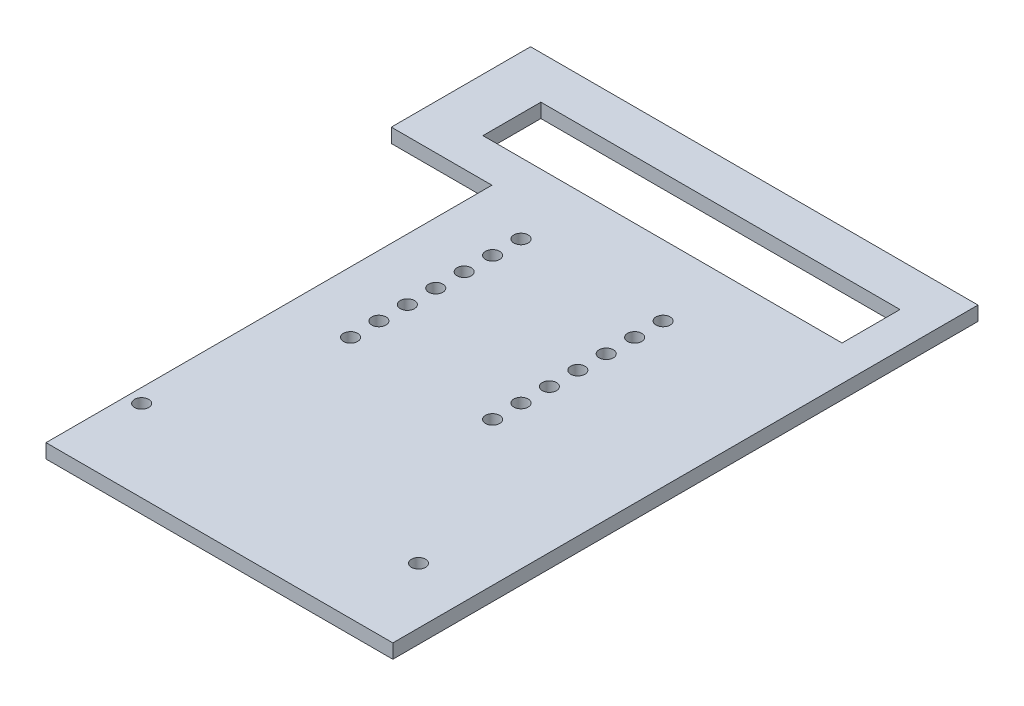
ISO-10303-21;
HEADER;
FILE_DESCRIPTION(('STEP AP214'),'2;1');
FILE_NAME('part.step','',(''),(''),'','','');
FILE_SCHEMA(('AUTOMOTIVE_DESIGN { 1 0 10303 214 1 1 1 1 }'));
ENDSEC;
DATA;
#1=APPLICATION_CONTEXT('core data for automotive mechanical design processes');
#2=APPLICATION_PROTOCOL_DEFINITION('international standard','automotive_design',2000,#1);
#3=PRODUCT_CONTEXT('',#1,'mechanical');
#4=PRODUCT('Part','Part','',(#3));
#5=PRODUCT_RELATED_PRODUCT_CATEGORY('part','',(#4));
#6=PRODUCT_DEFINITION_FORMATION('','',#4);
#7=PRODUCT_DEFINITION_CONTEXT('part definition',#1,'design');
#8=PRODUCT_DEFINITION('design','',#6,#7);
#9=PRODUCT_DEFINITION_SHAPE('','',#8);
#10=(LENGTH_UNIT() NAMED_UNIT(*) SI_UNIT(.MILLI.,.METRE.));
#11=(NAMED_UNIT(*) PLANE_ANGLE_UNIT() SI_UNIT($,.RADIAN.));
#12=(NAMED_UNIT(*) SI_UNIT($,.STERADIAN.) SOLID_ANGLE_UNIT());
#13=UNCERTAINTY_MEASURE_WITH_UNIT(LENGTH_MEASURE(1.E-05),#10,'distance_accuracy_value','');
#14=(GEOMETRIC_REPRESENTATION_CONTEXT(3) GLOBAL_UNCERTAINTY_ASSIGNED_CONTEXT((#13)) GLOBAL_UNIT_ASSIGNED_CONTEXT((#10,
#11,#12)) REPRESENTATION_CONTEXT('',''));
#15=CARTESIAN_POINT('',(0.,0.,0.));
#16=DIRECTION('',(0.,0.,1.));
#17=DIRECTION('',(1.,0.,0.));
#18=AXIS2_PLACEMENT_3D('',#15,#16,#17);
#19=CARTESIAN_POINT('',(-80.,-3.175,-112.5));
#20=DIRECTION('',(0.,0.,-1.));
#21=DIRECTION('',(-1.,0.,0.));
#22=AXIS2_PLACEMENT_3D('',#19,#20,#21);
#23=PLANE('',#22);
#24=DIRECTION('',(0.,-1.,0.));
#25=VECTOR('',#24,1.);
#26=CARTESIAN_POINT('',(0.,-3.175,-112.5));
#27=LINE('',#26,#25);
#28=CARTESIAN_POINT('',(0.,0.,-112.5));
#29=VERTEX_POINT('',#28);
#30=CARTESIAN_POINT('',(0.,-3.175,-112.5));
#31=VERTEX_POINT('',#30);
#32=EDGE_CURVE('E264',#29,#31,#27,.T.);
#33=ORIENTED_EDGE('',*,*,#32,.F.);
#34=DIRECTION('',(-1.,0.,0.));
#35=VECTOR('',#34,1.);
#36=CARTESIAN_POINT('',(-80.,0.,-112.5));
#37=LINE('',#36,#35);
#38=CARTESIAN_POINT('',(100.,0.,-112.5));
#39=VERTEX_POINT('',#38);
#40=EDGE_CURVE('E126',#39,#29,#37,.T.);
#41=ORIENTED_EDGE('',*,*,#40,.F.);
#42=DIRECTION('',(0.,1.,0.));
#43=VECTOR('',#42,1.);
#44=CARTESIAN_POINT('',(100.,-3.175,-112.5));
#45=LINE('',#44,#43);
#46=CARTESIAN_POINT('',(100.,-3.175,-112.5));
#47=VERTEX_POINT('',#46);
#48=EDGE_CURVE('E40',#47,#39,#45,.T.);
#49=ORIENTED_EDGE('',*,*,#48,.F.);
#50=DIRECTION('',(-1.,0.,0.));
#51=VECTOR('',#50,1.);
#52=CARTESIAN_POINT('',(-80.,-3.175,-112.5));
#53=LINE('',#52,#51);
#54=EDGE_CURVE('E134',#47,#31,#53,.T.);
#55=ORIENTED_EDGE('',*,*,#54,.T.);
#56=EDGE_LOOP('',(#33,#41,#49,#55));
#57=FACE_BOUND('',#56,.T.);
#58=ADVANCED_FACE('F32',(#57),#23,.T.);
#59=CARTESIAN_POINT('',(100.,-3.175,-112.5));
#60=DIRECTION('',(1.,0.,0.));
#61=DIRECTION('',(0.,0.,-1.));
#62=AXIS2_PLACEMENT_3D('',#59,#60,#61);
#63=PLANE('',#62);
#64=DIRECTION('',(0.,1.,0.));
#65=VECTOR('',#64,1.);
#66=CARTESIAN_POINT('',(100.,-3.175,18.2795002758667));
#67=LINE('',#66,#65);
#68=CARTESIAN_POINT('',(100.,-3.175,18.2795002758667));
#69=VERTEX_POINT('',#68);
#70=CARTESIAN_POINT('',(100.,0.,18.2795002758667));
#71=VERTEX_POINT('',#70);
#72=EDGE_CURVE('E107',#69,#71,#67,.T.);
#73=ORIENTED_EDGE('',*,*,#72,.F.);
#74=DIRECTION('',(0.,0.,-1.));
#75=VECTOR('',#74,1.);
#76=CARTESIAN_POINT('',(100.,-3.175,-112.5));
#77=LINE('',#76,#75);
#78=EDGE_CURVE('E129',#69,#47,#77,.T.);
#79=ORIENTED_EDGE('',*,*,#78,.T.);
#80=ORIENTED_EDGE('',*,*,#48,.T.);
#81=DIRECTION('',(0.,0.,-1.));
#82=VECTOR('',#81,1.);
#83=CARTESIAN_POINT('',(100.,0.,-112.5));
#84=LINE('',#83,#82);
#85=EDGE_CURVE('E120',#71,#39,#84,.T.);
#86=ORIENTED_EDGE('',*,*,#85,.F.);
#87=EDGE_LOOP('',(#73,#79,#80,#86));
#88=FACE_BOUND('',#87,.T.);
#89=ADVANCED_FACE('F34',(#88),#63,.T.);
#90=CARTESIAN_POINT('',(-80.,-3.175,0.));
#91=DIRECTION('',(0.,1.,0.));
#92=DIRECTION('',(0.,0.,1.));
#93=AXIS2_PLACEMENT_3D('',#90,#91,#92);
#94=PLANE('',#93);
#95=CARTESIAN_POINT('',(87.4621488064451,-3.175,0.));
#96=DIRECTION('',(0.,1.,0.));
#97=DIRECTION('',(0.,0.,1.));
#98=AXIS2_PLACEMENT_3D('',#95,#96,#97);
#99=CIRCLE('',#98,1.5875);
#100=CARTESIAN_POINT('',(87.4621488064451,-3.175,1.5875));
#101=VERTEX_POINT('',#100);
#102=EDGE_CURVE('E258',#101,#101,#99,.T.);
#103=ORIENTED_EDGE('',*,*,#102,.T.);
#104=EDGE_LOOP('',(#103));
#105=FACE_BOUND('',#104,.T.);
#106=CARTESIAN_POINT('',(25.5827615819861,-3.175,0.));
#107=DIRECTION('',(0.,1.,0.));
#108=DIRECTION('',(0.,0.,1.));
#109=AXIS2_PLACEMENT_3D('',#106,#107,#108);
#110=CIRCLE('',#109,1.5875);
#111=CARTESIAN_POINT('',(25.5827615819861,-3.175,1.5875));
#112=VERTEX_POINT('',#111);
#113=EDGE_CURVE('E252',#112,#112,#110,.T.);
#114=ORIENTED_EDGE('',*,*,#113,.T.);
#115=EDGE_LOOP('',(#114));
#116=FACE_BOUND('',#115,.T.);
#117=CARTESIAN_POINT('',(67.8940457021954,-3.175,-36.1188));
#118=DIRECTION('',(0.,1.,0.));
#119=DIRECTION('',(0.,0.,1.));
#120=AXIS2_PLACEMENT_3D('',#117,#118,#119);
#121=CIRCLE('',#120,1.58749999999999);
#122=CARTESIAN_POINT('',(67.8940457021954,-3.175,-34.5313));
#123=VERTEX_POINT('',#122);
#124=EDGE_CURVE('E246',#123,#123,#121,.T.);
#125=ORIENTED_EDGE('',*,*,#124,.T.);
#126=EDGE_LOOP('',(#125));
#127=FACE_BOUND('',#126,.T.);
#128=CARTESIAN_POINT('',(67.8940457021954,-3.175,-42.4688));
#129=DIRECTION('',(0.,1.,0.));
#130=DIRECTION('',(0.,0.,1.));
#131=AXIS2_PLACEMENT_3D('',#128,#129,#130);
#132=CIRCLE('',#131,1.58749999999999);
#133=CARTESIAN_POINT('',(67.8940457021954,-3.175,-40.8813));
#134=VERTEX_POINT('',#133);
#135=EDGE_CURVE('E240',#134,#134,#132,.T.);
#136=ORIENTED_EDGE('',*,*,#135,.T.);
#137=EDGE_LOOP('',(#136));
#138=FACE_BOUND('',#137,.T.);
#139=CARTESIAN_POINT('',(67.8940457021954,-3.175,-48.8188));
#140=DIRECTION('',(0.,1.,0.));
#141=DIRECTION('',(0.,0.,1.));
#142=AXIS2_PLACEMENT_3D('',#139,#140,#141);
#143=CIRCLE('',#142,1.58749999999999);
#144=CARTESIAN_POINT('',(67.8940457021954,-3.175,-47.2313));
#145=VERTEX_POINT('',#144);
#146=EDGE_CURVE('E234',#145,#145,#143,.T.);
#147=ORIENTED_EDGE('',*,*,#146,.T.);
#148=EDGE_LOOP('',(#147));
#149=FACE_BOUND('',#148,.T.);
#150=CARTESIAN_POINT('',(67.8940457021954,-3.175,-55.1688));
#151=DIRECTION('',(0.,1.,0.));
#152=DIRECTION('',(0.,0.,1.));
#153=AXIS2_PLACEMENT_3D('',#150,#151,#152);
#154=CIRCLE('',#153,1.58749999999999);
#155=CARTESIAN_POINT('',(67.8940457021954,-3.175,-53.5813));
#156=VERTEX_POINT('',#155);
#157=EDGE_CURVE('E228',#156,#156,#154,.T.);
#158=ORIENTED_EDGE('',*,*,#157,.T.);
#159=EDGE_LOOP('',(#158));
#160=FACE_BOUND('',#159,.T.);
#161=CARTESIAN_POINT('',(67.8940457021954,-3.175,-61.5188));
#162=DIRECTION('',(0.,1.,0.));
#163=DIRECTION('',(0.,0.,1.));
#164=AXIS2_PLACEMENT_3D('',#161,#162,#163);
#165=CIRCLE('',#164,1.58749999999999);
#166=CARTESIAN_POINT('',(67.8940457021954,-3.175,-59.9313));
#167=VERTEX_POINT('',#166);
#168=EDGE_CURVE('E222',#167,#167,#165,.T.);
#169=ORIENTED_EDGE('',*,*,#168,.T.);
#170=EDGE_LOOP('',(#169));
#171=FACE_BOUND('',#170,.T.);
#172=CARTESIAN_POINT('',(67.8940457021954,-3.175,-67.8688));
#173=DIRECTION('',(0.,1.,0.));
#174=DIRECTION('',(0.,0.,1.));
#175=AXIS2_PLACEMENT_3D('',#172,#173,#174);
#176=CIRCLE('',#175,1.58749999999999);
#177=CARTESIAN_POINT('',(67.8940457021954,-3.175,-66.2813));
#178=VERTEX_POINT('',#177);
#179=EDGE_CURVE('E216',#178,#178,#176,.T.);
#180=ORIENTED_EDGE('',*,*,#179,.T.);
#181=EDGE_LOOP('',(#180));
#182=FACE_BOUND('',#181,.T.);
#183=CARTESIAN_POINT('',(67.8940457021954,-3.175,-74.2188));
#184=DIRECTION('',(0.,1.,0.));
#185=DIRECTION('',(0.,0.,1.));
#186=AXIS2_PLACEMENT_3D('',#183,#184,#185);
#187=CIRCLE('',#186,1.58749999999999);
#188=CARTESIAN_POINT('',(67.8940457021954,-3.175,-72.6313));
#189=VERTEX_POINT('',#188);
#190=EDGE_CURVE('E210',#189,#189,#187,.T.);
#191=ORIENTED_EDGE('',*,*,#190,.T.);
#192=EDGE_LOOP('',(#191));
#193=FACE_BOUND('',#192,.T.);
#194=CARTESIAN_POINT('',(36.1440457021954,-3.175,-36.1188));
#195=DIRECTION('',(0.,1.,0.));
#196=DIRECTION('',(0.,0.,1.));
#197=AXIS2_PLACEMENT_3D('',#194,#195,#196);
#198=CIRCLE('',#197,1.5875);
#199=CARTESIAN_POINT('',(36.1440457021954,-3.175,-34.5313));
#200=VERTEX_POINT('',#199);
#201=EDGE_CURVE('E204',#200,#200,#198,.T.);
#202=ORIENTED_EDGE('',*,*,#201,.T.);
#203=EDGE_LOOP('',(#202));
#204=FACE_BOUND('',#203,.T.);
#205=CARTESIAN_POINT('',(36.1440457021954,-3.175,-42.4688));
#206=DIRECTION('',(0.,1.,0.));
#207=DIRECTION('',(0.,0.,1.));
#208=AXIS2_PLACEMENT_3D('',#205,#206,#207);
#209=CIRCLE('',#208,1.5875);
#210=CARTESIAN_POINT('',(36.1440457021954,-3.175,-40.8813));
#211=VERTEX_POINT('',#210);
#212=EDGE_CURVE('E198',#211,#211,#209,.T.);
#213=ORIENTED_EDGE('',*,*,#212,.T.);
#214=EDGE_LOOP('',(#213));
#215=FACE_BOUND('',#214,.T.);
#216=CARTESIAN_POINT('',(36.1440457021954,-3.175,-48.8188));
#217=DIRECTION('',(0.,1.,0.));
#218=DIRECTION('',(0.,0.,1.));
#219=AXIS2_PLACEMENT_3D('',#216,#217,#218);
#220=CIRCLE('',#219,1.5875);
#221=CARTESIAN_POINT('',(36.1440457021954,-3.175,-47.2313));
#222=VERTEX_POINT('',#221);
#223=EDGE_CURVE('E192',#222,#222,#220,.T.);
#224=ORIENTED_EDGE('',*,*,#223,.T.);
#225=EDGE_LOOP('',(#224));
#226=FACE_BOUND('',#225,.T.);
#227=CARTESIAN_POINT('',(36.1440457021954,-3.175,-55.1688));
#228=DIRECTION('',(0.,1.,0.));
#229=DIRECTION('',(0.,0.,1.));
#230=AXIS2_PLACEMENT_3D('',#227,#228,#229);
#231=CIRCLE('',#230,1.5875);
#232=CARTESIAN_POINT('',(36.1440457021954,-3.175,-53.5813));
#233=VERTEX_POINT('',#232);
#234=EDGE_CURVE('E186',#233,#233,#231,.T.);
#235=ORIENTED_EDGE('',*,*,#234,.T.);
#236=EDGE_LOOP('',(#235));
#237=FACE_BOUND('',#236,.T.);
#238=CARTESIAN_POINT('',(36.1440457021954,-3.175,-61.5188));
#239=DIRECTION('',(0.,1.,0.));
#240=DIRECTION('',(0.,0.,1.));
#241=AXIS2_PLACEMENT_3D('',#238,#239,#240);
#242=CIRCLE('',#241,1.5875);
#243=CARTESIAN_POINT('',(36.1440457021954,-3.175,-59.9313));
#244=VERTEX_POINT('',#243);
#245=EDGE_CURVE('E180',#244,#244,#242,.T.);
#246=ORIENTED_EDGE('',*,*,#245,.T.);
#247=EDGE_LOOP('',(#246));
#248=FACE_BOUND('',#247,.T.);
#249=CARTESIAN_POINT('',(36.1440457021954,-3.175,-67.8688));
#250=DIRECTION('',(0.,1.,0.));
#251=DIRECTION('',(0.,0.,1.));
#252=AXIS2_PLACEMENT_3D('',#249,#250,#251);
#253=CIRCLE('',#252,1.5875);
#254=CARTESIAN_POINT('',(36.1440457021954,-3.175,-66.2813));
#255=VERTEX_POINT('',#254);
#256=EDGE_CURVE('E174',#255,#255,#253,.T.);
#257=ORIENTED_EDGE('',*,*,#256,.T.);
#258=EDGE_LOOP('',(#257));
#259=FACE_BOUND('',#258,.T.);
#260=CARTESIAN_POINT('',(36.1440457021954,-3.175,-74.2188));
#261=DIRECTION('',(0.,1.,0.));
#262=DIRECTION('',(0.,0.,1.));
#263=AXIS2_PLACEMENT_3D('',#260,#261,#262);
#264=CIRCLE('',#263,1.5875);
#265=CARTESIAN_POINT('',(36.1440457021954,-3.175,-72.6313));
#266=VERTEX_POINT('',#265);
#267=EDGE_CURVE('E160',#266,#266,#264,.T.);
#268=ORIENTED_EDGE('',*,*,#267,.T.);
#269=EDGE_LOOP('',(#268));
#270=FACE_BOUND('',#269,.T.);
#271=DIRECTION('',(-1.,0.,0.));
#272=VECTOR('',#271,1.);
#273=CARTESIAN_POINT('',(11.8870457021954,-3.175,-102.9208));
#274=LINE('',#273,#272);
#275=CARTESIAN_POINT('',(92.1510457021954,-3.175,-102.9208));
#276=VERTEX_POINT('',#275);
#277=CARTESIAN_POINT('',(11.8870457021954,-3.175,-102.9208));
#278=VERTEX_POINT('',#277);
#279=EDGE_CURVE('E145',#276,#278,#274,.T.);
#280=ORIENTED_EDGE('',*,*,#279,.T.);
#281=DIRECTION('',(0.,0.,1.));
#282=VECTOR('',#281,1.);
#283=CARTESIAN_POINT('',(11.8870457021954,-3.175,-89.9668));
#284=LINE('',#283,#282);
#285=CARTESIAN_POINT('',(11.8870457021954,-3.175,-89.9668));
#286=VERTEX_POINT('',#285);
#287=EDGE_CURVE('E151',#278,#286,#284,.T.);
#288=ORIENTED_EDGE('',*,*,#287,.T.);
#289=DIRECTION('',(1.,0.,0.));
#290=VECTOR('',#289,1.);
#291=CARTESIAN_POINT('',(11.8870457021954,-3.175,-89.9668));
#292=LINE('',#291,#290);
#293=CARTESIAN_POINT('',(92.1510457021954,-3.175,-89.9668));
#294=VERTEX_POINT('',#293);
#295=EDGE_CURVE('E166',#286,#294,#292,.T.);
#296=ORIENTED_EDGE('',*,*,#295,.T.);
#297=DIRECTION('',(0.,0.,-1.));
#298=VECTOR('',#297,1.);
#299=CARTESIAN_POINT('',(92.1510457021954,-3.175,-89.9668));
#300=LINE('',#299,#298);
#301=EDGE_CURVE('E163',#294,#276,#300,.T.);
#302=ORIENTED_EDGE('',*,*,#301,.T.);
#303=EDGE_LOOP('',(#280,#288,#296,#302));
#304=FACE_BOUND('',#303,.T.);
#305=ORIENTED_EDGE('',*,*,#78,.F.);
#306=DIRECTION('',(-1.,0.,0.));
#307=VECTOR('',#306,1.);
#308=CARTESIAN_POINT('',(-71.9285537075507,-3.175,18.2795002758667));
#309=LINE('',#308,#307);
#310=CARTESIAN_POINT('',(22.4835921673436,-3.175,18.2795002758667));
#311=VERTEX_POINT('',#310);
#312=EDGE_CURVE('E110',#69,#311,#309,.T.);
#313=ORIENTED_EDGE('',*,*,#312,.T.);
#314=DIRECTION('',(0.,0.,-1.));
#315=VECTOR('',#314,1.);
#316=CARTESIAN_POINT('',(22.4835921673436,-3.175,78.7162878268351));
#317=LINE('',#316,#315);
#318=CARTESIAN_POINT('',(22.4835921673436,-3.175,-81.375621875039));
#319=VERTEX_POINT('',#318);
#320=EDGE_CURVE('E271',#311,#319,#317,.T.);
#321=ORIENTED_EDGE('',*,*,#320,.T.);
#322=DIRECTION('',(-1.,0.,0.));
#323=VECTOR('',#322,1.);
#324=CARTESIAN_POINT('',(0.,-3.175,-81.375621875039));
#325=LINE('',#324,#323);
#326=CARTESIAN_POINT('',(0.,-3.175,-81.375621875039));
#327=VERTEX_POINT('',#326);
#328=EDGE_CURVE('E274',#319,#327,#325,.T.);
#329=ORIENTED_EDGE('',*,*,#328,.T.);
#330=DIRECTION('',(0.,0.,-1.));
#331=VECTOR('',#330,1.);
#332=CARTESIAN_POINT('',(0.,-3.175,-118.606298549893));
#333=LINE('',#332,#331);
#334=EDGE_CURVE('E279',#327,#31,#333,.T.);
#335=ORIENTED_EDGE('',*,*,#334,.T.);
#336=ORIENTED_EDGE('',*,*,#54,.F.);
#337=EDGE_LOOP('',(#305,#313,#321,#329,#335,#336));
#338=FACE_BOUND('',#337,.T.);
#339=ADVANCED_FACE('F286',(#105,#116,#127,#138,#149,#160,#171,#182,#193,#204,#215,#226,#237,
#248,#259,#270,#304,#338),#94,.F.);
#340=CARTESIAN_POINT('',(-80.,0.,0.));
#341=DIRECTION('',(0.,1.,0.));
#342=DIRECTION('',(0.,0.,1.));
#343=AXIS2_PLACEMENT_3D('',#340,#341,#342);
#344=PLANE('',#343);
#345=DIRECTION('',(-1.,0.,0.));
#346=VECTOR('',#345,1.);
#347=CARTESIAN_POINT('',(-71.9285537075507,0.,18.2795002758667));
#348=LINE('',#347,#346);
#349=CARTESIAN_POINT('',(22.4835921673436,0.,18.2795002758667));
#350=VERTEX_POINT('',#349);
#351=EDGE_CURVE('E47',#71,#350,#348,.T.);
#352=ORIENTED_EDGE('',*,*,#351,.F.);
#353=ORIENTED_EDGE('',*,*,#85,.T.);
#354=ORIENTED_EDGE('',*,*,#40,.T.);
#355=DIRECTION('',(0.,0.,-1.));
#356=VECTOR('',#355,1.);
#357=CARTESIAN_POINT('',(0.,0.,-118.606298549893));
#358=LINE('',#357,#356);
#359=CARTESIAN_POINT('',(0.,0.,-81.375621875039));
#360=VERTEX_POINT('',#359);
#361=EDGE_CURVE('E275',#360,#29,#358,.T.);
#362=ORIENTED_EDGE('',*,*,#361,.F.);
#363=DIRECTION('',(-1.,0.,0.));
#364=VECTOR('',#363,1.);
#365=CARTESIAN_POINT('',(0.,0.,-81.375621875039));
#366=LINE('',#365,#364);
#367=CARTESIAN_POINT('',(22.4835921673436,0.,-81.375621875039));
#368=VERTEX_POINT('',#367);
#369=EDGE_CURVE('E54',#368,#360,#366,.T.);
#370=ORIENTED_EDGE('',*,*,#369,.F.);
#371=DIRECTION('',(0.,0.,-1.));
#372=VECTOR('',#371,1.);
#373=CARTESIAN_POINT('',(22.4835921673436,0.,78.7162878268351));
#374=LINE('',#373,#372);
#375=EDGE_CURVE('E122',#350,#368,#374,.T.);
#376=ORIENTED_EDGE('',*,*,#375,.F.);
#377=EDGE_LOOP('',(#352,#353,#354,#362,#370,#376));
#378=FACE_BOUND('',#377,.T.);
#379=CARTESIAN_POINT('',(87.4621488064451,0.,0.));
#380=DIRECTION('',(0.,1.,0.));
#381=DIRECTION('',(0.,0.,1.));
#382=AXIS2_PLACEMENT_3D('',#379,#380,#381);
#383=CIRCLE('',#382,1.5875);
#384=CARTESIAN_POINT('',(87.4621488064451,0.,1.5875));
#385=VERTEX_POINT('',#384);
#386=EDGE_CURVE('E261',#385,#385,#383,.T.);
#387=ORIENTED_EDGE('',*,*,#386,.F.);
#388=EDGE_LOOP('',(#387));
#389=FACE_BOUND('',#388,.T.);
#390=CARTESIAN_POINT('',(25.5827615819861,0.,0.));
#391=DIRECTION('',(0.,1.,0.));
#392=DIRECTION('',(0.,0.,1.));
#393=AXIS2_PLACEMENT_3D('',#390,#391,#392);
#394=CIRCLE('',#393,1.5875);
#395=CARTESIAN_POINT('',(25.5827615819861,0.,1.5875));
#396=VERTEX_POINT('',#395);
#397=EDGE_CURVE('E255',#396,#396,#394,.T.);
#398=ORIENTED_EDGE('',*,*,#397,.F.);
#399=EDGE_LOOP('',(#398));
#400=FACE_BOUND('',#399,.T.);
#401=CARTESIAN_POINT('',(67.8940457021954,0.,-36.1188));
#402=DIRECTION('',(0.,1.,0.));
#403=DIRECTION('',(0.,0.,1.));
#404=AXIS2_PLACEMENT_3D('',#401,#402,#403);
#405=CIRCLE('',#404,1.58749999999999);
#406=CARTESIAN_POINT('',(67.8940457021954,0.,-34.5313));
#407=VERTEX_POINT('',#406);
#408=EDGE_CURVE('E249',#407,#407,#405,.T.);
#409=ORIENTED_EDGE('',*,*,#408,.F.);
#410=EDGE_LOOP('',(#409));
#411=FACE_BOUND('',#410,.T.);
#412=CARTESIAN_POINT('',(67.8940457021954,0.,-42.4688));
#413=DIRECTION('',(0.,1.,0.));
#414=DIRECTION('',(0.,0.,1.));
#415=AXIS2_PLACEMENT_3D('',#412,#413,#414);
#416=CIRCLE('',#415,1.58749999999999);
#417=CARTESIAN_POINT('',(67.8940457021954,0.,-40.8813));
#418=VERTEX_POINT('',#417);
#419=EDGE_CURVE('E243',#418,#418,#416,.T.);
#420=ORIENTED_EDGE('',*,*,#419,.F.);
#421=EDGE_LOOP('',(#420));
#422=FACE_BOUND('',#421,.T.);
#423=CARTESIAN_POINT('',(67.8940457021954,0.,-48.8188));
#424=DIRECTION('',(0.,1.,0.));
#425=DIRECTION('',(0.,0.,1.));
#426=AXIS2_PLACEMENT_3D('',#423,#424,#425);
#427=CIRCLE('',#426,1.58749999999999);
#428=CARTESIAN_POINT('',(67.8940457021954,0.,-47.2313));
#429=VERTEX_POINT('',#428);
#430=EDGE_CURVE('E237',#429,#429,#427,.T.);
#431=ORIENTED_EDGE('',*,*,#430,.F.);
#432=EDGE_LOOP('',(#431));
#433=FACE_BOUND('',#432,.T.);
#434=CARTESIAN_POINT('',(67.8940457021954,0.,-55.1688));
#435=DIRECTION('',(0.,1.,0.));
#436=DIRECTION('',(0.,0.,1.));
#437=AXIS2_PLACEMENT_3D('',#434,#435,#436);
#438=CIRCLE('',#437,1.58749999999999);
#439=CARTESIAN_POINT('',(67.8940457021954,0.,-53.5813));
#440=VERTEX_POINT('',#439);
#441=EDGE_CURVE('E231',#440,#440,#438,.T.);
#442=ORIENTED_EDGE('',*,*,#441,.F.);
#443=EDGE_LOOP('',(#442));
#444=FACE_BOUND('',#443,.T.);
#445=CARTESIAN_POINT('',(67.8940457021954,0.,-61.5188));
#446=DIRECTION('',(0.,1.,0.));
#447=DIRECTION('',(0.,0.,1.));
#448=AXIS2_PLACEMENT_3D('',#445,#446,#447);
#449=CIRCLE('',#448,1.58749999999999);
#450=CARTESIAN_POINT('',(67.8940457021954,0.,-59.9313));
#451=VERTEX_POINT('',#450);
#452=EDGE_CURVE('E225',#451,#451,#449,.T.);
#453=ORIENTED_EDGE('',*,*,#452,.F.);
#454=EDGE_LOOP('',(#453));
#455=FACE_BOUND('',#454,.T.);
#456=CARTESIAN_POINT('',(67.8940457021954,0.,-67.8688));
#457=DIRECTION('',(0.,1.,0.));
#458=DIRECTION('',(0.,0.,1.));
#459=AXIS2_PLACEMENT_3D('',#456,#457,#458);
#460=CIRCLE('',#459,1.58749999999999);
#461=CARTESIAN_POINT('',(67.8940457021954,0.,-66.2813));
#462=VERTEX_POINT('',#461);
#463=EDGE_CURVE('E219',#462,#462,#460,.T.);
#464=ORIENTED_EDGE('',*,*,#463,.F.);
#465=EDGE_LOOP('',(#464));
#466=FACE_BOUND('',#465,.T.);
#467=CARTESIAN_POINT('',(67.8940457021954,0.,-74.2188));
#468=DIRECTION('',(0.,1.,0.));
#469=DIRECTION('',(0.,0.,1.));
#470=AXIS2_PLACEMENT_3D('',#467,#468,#469);
#471=CIRCLE('',#470,1.58749999999999);
#472=CARTESIAN_POINT('',(67.8940457021954,0.,-72.6313));
#473=VERTEX_POINT('',#472);
#474=EDGE_CURVE('E213',#473,#473,#471,.T.);
#475=ORIENTED_EDGE('',*,*,#474,.F.);
#476=EDGE_LOOP('',(#475));
#477=FACE_BOUND('',#476,.T.);
#478=CARTESIAN_POINT('',(36.1440457021954,0.,-36.1188));
#479=DIRECTION('',(0.,1.,0.));
#480=DIRECTION('',(0.,0.,1.));
#481=AXIS2_PLACEMENT_3D('',#478,#479,#480);
#482=CIRCLE('',#481,1.5875);
#483=CARTESIAN_POINT('',(36.1440457021954,0.,-34.5313));
#484=VERTEX_POINT('',#483);
#485=EDGE_CURVE('E207',#484,#484,#482,.T.);
#486=ORIENTED_EDGE('',*,*,#485,.F.);
#487=EDGE_LOOP('',(#486));
#488=FACE_BOUND('',#487,.T.);
#489=CARTESIAN_POINT('',(36.1440457021954,0.,-42.4688));
#490=DIRECTION('',(0.,1.,0.));
#491=DIRECTION('',(0.,0.,1.));
#492=AXIS2_PLACEMENT_3D('',#489,#490,#491);
#493=CIRCLE('',#492,1.5875);
#494=CARTESIAN_POINT('',(36.1440457021954,0.,-40.8813));
#495=VERTEX_POINT('',#494);
#496=EDGE_CURVE('E201',#495,#495,#493,.T.);
#497=ORIENTED_EDGE('',*,*,#496,.F.);
#498=EDGE_LOOP('',(#497));
#499=FACE_BOUND('',#498,.T.);
#500=CARTESIAN_POINT('',(36.1440457021954,0.,-48.8188));
#501=DIRECTION('',(0.,1.,0.));
#502=DIRECTION('',(0.,0.,1.));
#503=AXIS2_PLACEMENT_3D('',#500,#501,#502);
#504=CIRCLE('',#503,1.5875);
#505=CARTESIAN_POINT('',(36.1440457021954,0.,-47.2313));
#506=VERTEX_POINT('',#505);
#507=EDGE_CURVE('E195',#506,#506,#504,.T.);
#508=ORIENTED_EDGE('',*,*,#507,.F.);
#509=EDGE_LOOP('',(#508));
#510=FACE_BOUND('',#509,.T.);
#511=CARTESIAN_POINT('',(36.1440457021954,0.,-55.1688));
#512=DIRECTION('',(0.,1.,0.));
#513=DIRECTION('',(0.,0.,1.));
#514=AXIS2_PLACEMENT_3D('',#511,#512,#513);
#515=CIRCLE('',#514,1.5875);
#516=CARTESIAN_POINT('',(36.1440457021954,0.,-53.5813));
#517=VERTEX_POINT('',#516);
#518=EDGE_CURVE('E189',#517,#517,#515,.T.);
#519=ORIENTED_EDGE('',*,*,#518,.F.);
#520=EDGE_LOOP('',(#519));
#521=FACE_BOUND('',#520,.T.);
#522=CARTESIAN_POINT('',(36.1440457021954,0.,-61.5188));
#523=DIRECTION('',(0.,1.,0.));
#524=DIRECTION('',(0.,0.,1.));
#525=AXIS2_PLACEMENT_3D('',#522,#523,#524);
#526=CIRCLE('',#525,1.5875);
#527=CARTESIAN_POINT('',(36.1440457021954,0.,-59.9313));
#528=VERTEX_POINT('',#527);
#529=EDGE_CURVE('E183',#528,#528,#526,.T.);
#530=ORIENTED_EDGE('',*,*,#529,.F.);
#531=EDGE_LOOP('',(#530));
#532=FACE_BOUND('',#531,.T.);
#533=CARTESIAN_POINT('',(36.1440457021954,0.,-67.8688));
#534=DIRECTION('',(0.,1.,0.));
#535=DIRECTION('',(0.,0.,1.));
#536=AXIS2_PLACEMENT_3D('',#533,#534,#535);
#537=CIRCLE('',#536,1.5875);
#538=CARTESIAN_POINT('',(36.1440457021954,0.,-66.2813));
#539=VERTEX_POINT('',#538);
#540=EDGE_CURVE('E177',#539,#539,#537,.T.);
#541=ORIENTED_EDGE('',*,*,#540,.F.);
#542=EDGE_LOOP('',(#541));
#543=FACE_BOUND('',#542,.T.);
#544=CARTESIAN_POINT('',(36.1440457021954,0.,-74.2188));
#545=DIRECTION('',(0.,1.,0.));
#546=DIRECTION('',(0.,0.,1.));
#547=AXIS2_PLACEMENT_3D('',#544,#545,#546);
#548=CIRCLE('',#547,1.5875);
#549=CARTESIAN_POINT('',(36.1440457021954,0.,-72.6313));
#550=VERTEX_POINT('',#549);
#551=EDGE_CURVE('E171',#550,#550,#548,.T.);
#552=ORIENTED_EDGE('',*,*,#551,.F.);
#553=EDGE_LOOP('',(#552));
#554=FACE_BOUND('',#553,.T.);
#555=DIRECTION('',(0.,0.,1.));
#556=VECTOR('',#555,1.);
#557=CARTESIAN_POINT('',(11.8870457021954,0.,-89.9668));
#558=LINE('',#557,#556);
#559=CARTESIAN_POINT('',(11.8870457021954,0.,-102.9208));
#560=VERTEX_POINT('',#559);
#561=CARTESIAN_POINT('',(11.8870457021954,0.,-89.9668));
#562=VERTEX_POINT('',#561);
#563=EDGE_CURVE('E158',#560,#562,#558,.T.);
#564=ORIENTED_EDGE('',*,*,#563,.F.);
#565=DIRECTION('',(-1.,0.,0.));
#566=VECTOR('',#565,1.);
#567=CARTESIAN_POINT('',(11.8870457021954,0.,-102.9208));
#568=LINE('',#567,#566);
#569=CARTESIAN_POINT('',(92.1510457021954,0.,-102.9208));
#570=VERTEX_POINT('',#569);
#571=EDGE_CURVE('E148',#570,#560,#568,.T.);
#572=ORIENTED_EDGE('',*,*,#571,.F.);
#573=DIRECTION('',(0.,0.,-1.));
#574=VECTOR('',#573,1.);
#575=CARTESIAN_POINT('',(92.1510457021954,0.,-89.9668));
#576=LINE('',#575,#574);
#577=CARTESIAN_POINT('',(92.1510457021954,0.,-89.9668));
#578=VERTEX_POINT('',#577);
#579=EDGE_CURVE('E152',#578,#570,#576,.T.);
#580=ORIENTED_EDGE('',*,*,#579,.F.);
#581=DIRECTION('',(1.,0.,0.));
#582=VECTOR('',#581,1.);
#583=CARTESIAN_POINT('',(11.8870457021954,0.,-89.9668));
#584=LINE('',#583,#582);
#585=EDGE_CURVE('E155',#562,#578,#584,.T.);
#586=ORIENTED_EDGE('',*,*,#585,.F.);
#587=EDGE_LOOP('',(#564,#572,#580,#586));
#588=FACE_BOUND('',#587,.T.);
#589=ADVANCED_FACE('F117',(#378,#389,#400,#411,#422,#433,#444,#455,#466,#477,#488,#499,#510,
#521,#532,#543,#554,#588),#344,.T.);
#590=CARTESIAN_POINT('',(11.8870457021954,-3.175,-89.9668));
#591=DIRECTION('',(-1.,0.,0.));
#592=DIRECTION('',(0.,0.,1.));
#593=AXIS2_PLACEMENT_3D('',#590,#591,#592);
#594=PLANE('',#593);
#595=ORIENTED_EDGE('',*,*,#563,.T.);
#596=DIRECTION('',(0.,1.,0.));
#597=VECTOR('',#596,1.);
#598=CARTESIAN_POINT('',(11.8870457021954,-3.175,-89.9668));
#599=LINE('',#598,#597);
#600=EDGE_CURVE('E141',#286,#562,#599,.T.);
#601=ORIENTED_EDGE('',*,*,#600,.F.);
#602=ORIENTED_EDGE('',*,*,#287,.F.);
#603=DIRECTION('',(0.,1.,0.));
#604=VECTOR('',#603,1.);
#605=CARTESIAN_POINT('',(11.8870457021954,-3.175,-102.9208));
#606=LINE('',#605,#604);
#607=EDGE_CURVE('E127',#278,#560,#606,.T.);
#608=ORIENTED_EDGE('',*,*,#607,.T.);
#609=EDGE_LOOP('',(#595,#601,#602,#608));
#610=FACE_BOUND('',#609,.T.);
#611=ADVANCED_FACE('F304',(#610),#594,.F.);
#612=CARTESIAN_POINT('',(11.8870457021954,-3.175,-102.9208));
#613=DIRECTION('',(0.,0.,-1.));
#614=DIRECTION('',(-1.,0.,0.));
#615=AXIS2_PLACEMENT_3D('',#612,#613,#614);
#616=PLANE('',#615);
#617=ORIENTED_EDGE('',*,*,#571,.T.);
#618=ORIENTED_EDGE('',*,*,#607,.F.);
#619=ORIENTED_EDGE('',*,*,#279,.F.);
#620=DIRECTION('',(0.,1.,0.));
#621=VECTOR('',#620,1.);
#622=CARTESIAN_POINT('',(92.1510457021954,-3.175,-102.9208));
#623=LINE('',#622,#621);
#624=EDGE_CURVE('E131',#276,#570,#623,.T.);
#625=ORIENTED_EDGE('',*,*,#624,.T.);
#626=EDGE_LOOP('',(#617,#618,#619,#625));
#627=FACE_BOUND('',#626,.T.);
#628=ADVANCED_FACE('F310',(#627),#616,.F.);
#629=CARTESIAN_POINT('',(92.1510457021954,-3.175,-89.9668));
#630=DIRECTION('',(1.,0.,0.));
#631=DIRECTION('',(0.,0.,-1.));
#632=AXIS2_PLACEMENT_3D('',#629,#630,#631);
#633=PLANE('',#632);
#634=ORIENTED_EDGE('',*,*,#579,.T.);
#635=ORIENTED_EDGE('',*,*,#624,.F.);
#636=ORIENTED_EDGE('',*,*,#301,.F.);
#637=DIRECTION('',(0.,1.,0.));
#638=VECTOR('',#637,1.);
#639=CARTESIAN_POINT('',(92.1510457021954,-3.175,-89.9668));
#640=LINE('',#639,#638);
#641=EDGE_CURVE('E144',#294,#578,#640,.T.);
#642=ORIENTED_EDGE('',*,*,#641,.T.);
#643=EDGE_LOOP('',(#634,#635,#636,#642));
#644=FACE_BOUND('',#643,.T.);
#645=ADVANCED_FACE('F316',(#644),#633,.F.);
#646=CARTESIAN_POINT('',(11.8870457021954,-3.175,-89.9668));
#647=DIRECTION('',(0.,0.,1.));
#648=DIRECTION('',(1.,0.,0.));
#649=AXIS2_PLACEMENT_3D('',#646,#647,#648);
#650=PLANE('',#649);
#651=ORIENTED_EDGE('',*,*,#585,.T.);
#652=ORIENTED_EDGE('',*,*,#641,.F.);
#653=ORIENTED_EDGE('',*,*,#295,.F.);
#654=ORIENTED_EDGE('',*,*,#600,.T.);
#655=EDGE_LOOP('',(#651,#652,#653,#654));
#656=FACE_BOUND('',#655,.T.);
#657=ADVANCED_FACE('F312',(#656),#650,.F.);
#658=CARTESIAN_POINT('',(36.1440457021954,-3.175,-74.2188));
#659=DIRECTION('',(0.,1.,0.));
#660=DIRECTION('',(0.,0.,1.));
#661=AXIS2_PLACEMENT_3D('',#658,#659,#660);
#662=CYLINDRICAL_SURFACE('',#661,1.5875);
#663=ORIENTED_EDGE('',*,*,#267,.F.);
#664=EDGE_LOOP('',(#663));
#665=FACE_BOUND('',#664,.T.);
#666=ORIENTED_EDGE('',*,*,#551,.T.);
#667=EDGE_LOOP('',(#666));
#668=FACE_BOUND('',#667,.T.);
#669=ADVANCED_FACE('F315',(#665,#668),#662,.F.);
#670=CARTESIAN_POINT('',(36.1440457021954,-3.175,-67.8688));
#671=DIRECTION('',(0.,1.,0.));
#672=DIRECTION('',(0.,0.,1.));
#673=AXIS2_PLACEMENT_3D('',#670,#671,#672);
#674=CYLINDRICAL_SURFACE('',#673,1.5875);
#675=ORIENTED_EDGE('',*,*,#256,.F.);
#676=EDGE_LOOP('',(#675));
#677=FACE_BOUND('',#676,.T.);
#678=ORIENTED_EDGE('',*,*,#540,.T.);
#679=EDGE_LOOP('',(#678));
#680=FACE_BOUND('',#679,.T.);
#681=ADVANCED_FACE('F326',(#677,#680),#674,.F.);
#682=CARTESIAN_POINT('',(36.1440457021954,-3.175,-61.5188));
#683=DIRECTION('',(0.,1.,0.));
#684=DIRECTION('',(0.,0.,1.));
#685=AXIS2_PLACEMENT_3D('',#682,#683,#684);
#686=CYLINDRICAL_SURFACE('',#685,1.5875);
#687=ORIENTED_EDGE('',*,*,#245,.F.);
#688=EDGE_LOOP('',(#687));
#689=FACE_BOUND('',#688,.T.);
#690=ORIENTED_EDGE('',*,*,#529,.T.);
#691=EDGE_LOOP('',(#690));
#692=FACE_BOUND('',#691,.T.);
#693=ADVANCED_FACE('F330',(#689,#692),#686,.F.);
#694=CARTESIAN_POINT('',(36.1440457021954,-3.175,-55.1688));
#695=DIRECTION('',(0.,1.,0.));
#696=DIRECTION('',(0.,0.,1.));
#697=AXIS2_PLACEMENT_3D('',#694,#695,#696);
#698=CYLINDRICAL_SURFACE('',#697,1.5875);
#699=ORIENTED_EDGE('',*,*,#234,.F.);
#700=EDGE_LOOP('',(#699));
#701=FACE_BOUND('',#700,.T.);
#702=ORIENTED_EDGE('',*,*,#518,.T.);
#703=EDGE_LOOP('',(#702));
#704=FACE_BOUND('',#703,.T.);
#705=ADVANCED_FACE('F334',(#701,#704),#698,.F.);
#706=CARTESIAN_POINT('',(36.1440457021954,-3.175,-48.8188));
#707=DIRECTION('',(0.,1.,0.));
#708=DIRECTION('',(0.,0.,1.));
#709=AXIS2_PLACEMENT_3D('',#706,#707,#708);
#710=CYLINDRICAL_SURFACE('',#709,1.5875);
#711=ORIENTED_EDGE('',*,*,#223,.F.);
#712=EDGE_LOOP('',(#711));
#713=FACE_BOUND('',#712,.T.);
#714=ORIENTED_EDGE('',*,*,#507,.T.);
#715=EDGE_LOOP('',(#714));
#716=FACE_BOUND('',#715,.T.);
#717=ADVANCED_FACE('F338',(#713,#716),#710,.F.);
#718=CARTESIAN_POINT('',(36.1440457021954,-3.175,-42.4688));
#719=DIRECTION('',(0.,1.,0.));
#720=DIRECTION('',(0.,0.,1.));
#721=AXIS2_PLACEMENT_3D('',#718,#719,#720);
#722=CYLINDRICAL_SURFACE('',#721,1.5875);
#723=ORIENTED_EDGE('',*,*,#212,.F.);
#724=EDGE_LOOP('',(#723));
#725=FACE_BOUND('',#724,.T.);
#726=ORIENTED_EDGE('',*,*,#496,.T.);
#727=EDGE_LOOP('',(#726));
#728=FACE_BOUND('',#727,.T.);
#729=ADVANCED_FACE('F342',(#725,#728),#722,.F.);
#730=CARTESIAN_POINT('',(36.1440457021954,-3.175,-36.1188));
#731=DIRECTION('',(0.,1.,0.));
#732=DIRECTION('',(0.,0.,1.));
#733=AXIS2_PLACEMENT_3D('',#730,#731,#732);
#734=CYLINDRICAL_SURFACE('',#733,1.5875);
#735=ORIENTED_EDGE('',*,*,#201,.F.);
#736=EDGE_LOOP('',(#735));
#737=FACE_BOUND('',#736,.T.);
#738=ORIENTED_EDGE('',*,*,#485,.T.);
#739=EDGE_LOOP('',(#738));
#740=FACE_BOUND('',#739,.T.);
#741=ADVANCED_FACE('F346',(#737,#740),#734,.F.);
#742=CARTESIAN_POINT('',(67.8940457021954,-3.175,-74.2188));
#743=DIRECTION('',(0.,1.,0.));
#744=DIRECTION('',(0.,0.,1.));
#745=AXIS2_PLACEMENT_3D('',#742,#743,#744);
#746=CYLINDRICAL_SURFACE('',#745,1.58749999999999);
#747=ORIENTED_EDGE('',*,*,#190,.F.);
#748=EDGE_LOOP('',(#747));
#749=FACE_BOUND('',#748,.T.);
#750=ORIENTED_EDGE('',*,*,#474,.T.);
#751=EDGE_LOOP('',(#750));
#752=FACE_BOUND('',#751,.T.);
#753=ADVANCED_FACE('F350',(#749,#752),#746,.F.);
#754=CARTESIAN_POINT('',(67.8940457021954,-3.175,-67.8688));
#755=DIRECTION('',(0.,1.,0.));
#756=DIRECTION('',(0.,0.,1.));
#757=AXIS2_PLACEMENT_3D('',#754,#755,#756);
#758=CYLINDRICAL_SURFACE('',#757,1.58749999999999);
#759=ORIENTED_EDGE('',*,*,#179,.F.);
#760=EDGE_LOOP('',(#759));
#761=FACE_BOUND('',#760,.T.);
#762=ORIENTED_EDGE('',*,*,#463,.T.);
#763=EDGE_LOOP('',(#762));
#764=FACE_BOUND('',#763,.T.);
#765=ADVANCED_FACE('F354',(#761,#764),#758,.F.);
#766=CARTESIAN_POINT('',(67.8940457021954,-3.175,-61.5188));
#767=DIRECTION('',(0.,1.,0.));
#768=DIRECTION('',(0.,0.,1.));
#769=AXIS2_PLACEMENT_3D('',#766,#767,#768);
#770=CYLINDRICAL_SURFACE('',#769,1.58749999999999);
#771=ORIENTED_EDGE('',*,*,#168,.F.);
#772=EDGE_LOOP('',(#771));
#773=FACE_BOUND('',#772,.T.);
#774=ORIENTED_EDGE('',*,*,#452,.T.);
#775=EDGE_LOOP('',(#774));
#776=FACE_BOUND('',#775,.T.);
#777=ADVANCED_FACE('F358',(#773,#776),#770,.F.);
#778=CARTESIAN_POINT('',(67.8940457021954,-3.175,-55.1688));
#779=DIRECTION('',(0.,1.,0.));
#780=DIRECTION('',(0.,0.,1.));
#781=AXIS2_PLACEMENT_3D('',#778,#779,#780);
#782=CYLINDRICAL_SURFACE('',#781,1.58749999999999);
#783=ORIENTED_EDGE('',*,*,#157,.F.);
#784=EDGE_LOOP('',(#783));
#785=FACE_BOUND('',#784,.T.);
#786=ORIENTED_EDGE('',*,*,#441,.T.);
#787=EDGE_LOOP('',(#786));
#788=FACE_BOUND('',#787,.T.);
#789=ADVANCED_FACE('F362',(#785,#788),#782,.F.);
#790=CARTESIAN_POINT('',(67.8940457021954,-3.175,-48.8188));
#791=DIRECTION('',(0.,1.,0.));
#792=DIRECTION('',(0.,0.,1.));
#793=AXIS2_PLACEMENT_3D('',#790,#791,#792);
#794=CYLINDRICAL_SURFACE('',#793,1.58749999999999);
#795=ORIENTED_EDGE('',*,*,#146,.F.);
#796=EDGE_LOOP('',(#795));
#797=FACE_BOUND('',#796,.T.);
#798=ORIENTED_EDGE('',*,*,#430,.T.);
#799=EDGE_LOOP('',(#798));
#800=FACE_BOUND('',#799,.T.);
#801=ADVANCED_FACE('F366',(#797,#800),#794,.F.);
#802=CARTESIAN_POINT('',(67.8940457021954,-3.175,-42.4688));
#803=DIRECTION('',(0.,1.,0.));
#804=DIRECTION('',(0.,0.,1.));
#805=AXIS2_PLACEMENT_3D('',#802,#803,#804);
#806=CYLINDRICAL_SURFACE('',#805,1.58749999999999);
#807=ORIENTED_EDGE('',*,*,#135,.F.);
#808=EDGE_LOOP('',(#807));
#809=FACE_BOUND('',#808,.T.);
#810=ORIENTED_EDGE('',*,*,#419,.T.);
#811=EDGE_LOOP('',(#810));
#812=FACE_BOUND('',#811,.T.);
#813=ADVANCED_FACE('F370',(#809,#812),#806,.F.);
#814=CARTESIAN_POINT('',(67.8940457021954,-3.175,-36.1188));
#815=DIRECTION('',(0.,1.,0.));
#816=DIRECTION('',(0.,0.,1.));
#817=AXIS2_PLACEMENT_3D('',#814,#815,#816);
#818=CYLINDRICAL_SURFACE('',#817,1.58749999999999);
#819=ORIENTED_EDGE('',*,*,#124,.F.);
#820=EDGE_LOOP('',(#819));
#821=FACE_BOUND('',#820,.T.);
#822=ORIENTED_EDGE('',*,*,#408,.T.);
#823=EDGE_LOOP('',(#822));
#824=FACE_BOUND('',#823,.T.);
#825=ADVANCED_FACE('F374',(#821,#824),#818,.F.);
#826=CARTESIAN_POINT('',(25.5827615819861,-3.175,0.));
#827=DIRECTION('',(0.,1.,0.));
#828=DIRECTION('',(0.,0.,1.));
#829=AXIS2_PLACEMENT_3D('',#826,#827,#828);
#830=CYLINDRICAL_SURFACE('',#829,1.5875);
#831=ORIENTED_EDGE('',*,*,#113,.F.);
#832=EDGE_LOOP('',(#831));
#833=FACE_BOUND('',#832,.T.);
#834=ORIENTED_EDGE('',*,*,#397,.T.);
#835=EDGE_LOOP('',(#834));
#836=FACE_BOUND('',#835,.T.);
#837=ADVANCED_FACE('F378',(#833,#836),#830,.F.);
#838=CARTESIAN_POINT('',(87.4621488064451,-3.175,0.));
#839=DIRECTION('',(0.,1.,0.));
#840=DIRECTION('',(0.,0.,1.));
#841=AXIS2_PLACEMENT_3D('',#838,#839,#840);
#842=CYLINDRICAL_SURFACE('',#841,1.5875);
#843=ORIENTED_EDGE('',*,*,#102,.F.);
#844=EDGE_LOOP('',(#843));
#845=FACE_BOUND('',#844,.T.);
#846=ORIENTED_EDGE('',*,*,#386,.T.);
#847=EDGE_LOOP('',(#846));
#848=FACE_BOUND('',#847,.T.);
#849=ADVANCED_FACE('F382',(#845,#848),#842,.F.);
#850=CARTESIAN_POINT('',(0.,-3.175,-81.375621875039));
#851=DIRECTION('',(0.,0.,-1.));
#852=DIRECTION('',(-1.,0.,0.));
#853=AXIS2_PLACEMENT_3D('',#850,#851,#852);
#854=PLANE('',#853);
#855=ORIENTED_EDGE('',*,*,#369,.T.);
#856=DIRECTION('',(0.,1.,0.));
#857=VECTOR('',#856,1.);
#858=CARTESIAN_POINT('',(0.,-3.175,-81.375621875039));
#859=LINE('',#858,#857);
#860=EDGE_CURVE('E269',#327,#360,#859,.T.);
#861=ORIENTED_EDGE('',*,*,#860,.F.);
#862=ORIENTED_EDGE('',*,*,#328,.F.);
#863=DIRECTION('',(0.,1.,0.));
#864=VECTOR('',#863,1.);
#865=CARTESIAN_POINT('',(22.4835921673436,-3.175,-81.375621875039));
#866=LINE('',#865,#864);
#867=EDGE_CURVE('E268',#319,#368,#866,.T.);
#868=ORIENTED_EDGE('',*,*,#867,.T.);
#869=EDGE_LOOP('',(#855,#861,#862,#868));
#870=FACE_BOUND('',#869,.T.);
#871=ADVANCED_FACE('F291',(#870),#854,.F.);
#872=CARTESIAN_POINT('',(22.4835921673436,-3.175,78.7162878268351));
#873=DIRECTION('',(1.,0.,0.));
#874=DIRECTION('',(0.,0.,-1.));
#875=AXIS2_PLACEMENT_3D('',#872,#873,#874);
#876=PLANE('',#875);
#877=ORIENTED_EDGE('',*,*,#320,.F.);
#878=DIRECTION('',(0.,1.,0.));
#879=VECTOR('',#878,1.);
#880=CARTESIAN_POINT('',(22.4835921673436,-3.175,18.2795002758667));
#881=LINE('',#880,#879);
#882=EDGE_CURVE('E11',#311,#350,#881,.T.);
#883=ORIENTED_EDGE('',*,*,#882,.T.);
#884=ORIENTED_EDGE('',*,*,#375,.T.);
#885=ORIENTED_EDGE('',*,*,#867,.F.);
#886=EDGE_LOOP('',(#877,#883,#884,#885));
#887=FACE_BOUND('',#886,.T.);
#888=ADVANCED_FACE('F289',(#887),#876,.F.);
#889=CARTESIAN_POINT('',(0.,-3.175,-118.606298549893));
#890=DIRECTION('',(1.,0.,0.));
#891=DIRECTION('',(0.,0.,-1.));
#892=AXIS2_PLACEMENT_3D('',#889,#890,#891);
#893=PLANE('',#892);
#894=ORIENTED_EDGE('',*,*,#32,.T.);
#895=ORIENTED_EDGE('',*,*,#334,.F.);
#896=ORIENTED_EDGE('',*,*,#860,.T.);
#897=ORIENTED_EDGE('',*,*,#361,.T.);
#898=EDGE_LOOP('',(#894,#895,#896,#897));
#899=FACE_BOUND('',#898,.T.);
#900=ADVANCED_FACE('F294',(#899),#893,.F.);
#901=CARTESIAN_POINT('',(-71.9285537075507,-3.175,18.2795002758667));
#902=DIRECTION('',(0.,0.,-1.));
#903=DIRECTION('',(-1.,0.,0.));
#904=AXIS2_PLACEMENT_3D('',#901,#902,#903);
#905=PLANE('',#904);
#906=ORIENTED_EDGE('',*,*,#72,.T.);
#907=ORIENTED_EDGE('',*,*,#351,.T.);
#908=ORIENTED_EDGE('',*,*,#882,.F.);
#909=ORIENTED_EDGE('',*,*,#312,.F.);
#910=EDGE_LOOP('',(#906,#907,#908,#909));
#911=FACE_BOUND('',#910,.T.);
#912=ADVANCED_FACE('F108',(#911),#905,.F.);
#913=CLOSED_SHELL('',(#58,#89,#339,#589,#611,#628,#645,#657,#669,#681,#693,#705,#717,#729,#741,
#753,#765,#777,#789,#801,#813,#825,#837,#849,#871,#888,#900,#912));
#914=MANIFOLD_SOLID_BREP('B2',#913);
#915=ADVANCED_BREP_SHAPE_REPRESENTATION('',(#18,#914),#14);
#916=SHAPE_DEFINITION_REPRESENTATION(#9,#915);
ENDSEC;
END-ISO-10303-21;
